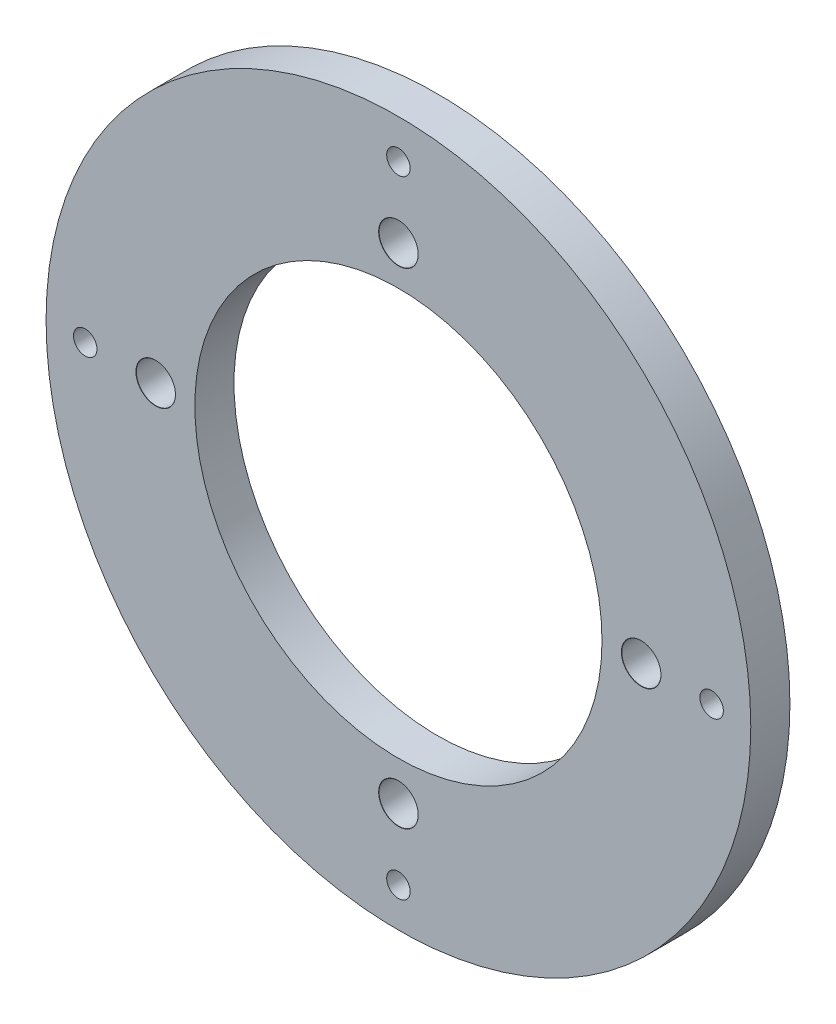
ISO-10303-21;
HEADER;
FILE_DESCRIPTION(('STEP AP214'),'2;1');
FILE_NAME('part.step','',(''),(''),'','','');
FILE_SCHEMA(('AUTOMOTIVE_DESIGN { 1 0 10303 214 1 1 1 1 }'));
ENDSEC;
DATA;
#1=APPLICATION_CONTEXT('core data for automotive mechanical design processes');
#2=APPLICATION_PROTOCOL_DEFINITION('international standard','automotive_design',2000,#1);
#3=PRODUCT_CONTEXT('',#1,'mechanical');
#4=PRODUCT('Part','Part','',(#3));
#5=PRODUCT_RELATED_PRODUCT_CATEGORY('part','',(#4));
#6=PRODUCT_DEFINITION_FORMATION('','',#4);
#7=PRODUCT_DEFINITION_CONTEXT('part definition',#1,'design');
#8=PRODUCT_DEFINITION('design','',#6,#7);
#9=PRODUCT_DEFINITION_SHAPE('','',#8);
#10=(LENGTH_UNIT() NAMED_UNIT(*) SI_UNIT(.MILLI.,.METRE.));
#11=(NAMED_UNIT(*) PLANE_ANGLE_UNIT() SI_UNIT($,.RADIAN.));
#12=(NAMED_UNIT(*) SI_UNIT($,.STERADIAN.) SOLID_ANGLE_UNIT());
#13=UNCERTAINTY_MEASURE_WITH_UNIT(LENGTH_MEASURE(1.E-05),#10,'distance_accuracy_value','');
#14=(GEOMETRIC_REPRESENTATION_CONTEXT(3) GLOBAL_UNCERTAINTY_ASSIGNED_CONTEXT((#13)) GLOBAL_UNIT_ASSIGNED_CONTEXT((#10,
#11,#12)) REPRESENTATION_CONTEXT('',''));
#15=CARTESIAN_POINT('',(0.,0.,0.));
#16=DIRECTION('',(0.,0.,1.));
#17=DIRECTION('',(1.,0.,0.));
#18=AXIS2_PLACEMENT_3D('',#15,#16,#17);
#19=CARTESIAN_POINT('',(0.,0.,5.));
#20=DIRECTION('',(0.,0.,1.));
#21=DIRECTION('',(1.,0.,0.));
#22=AXIS2_PLACEMENT_3D('',#19,#20,#21);
#23=PLANE('',#22);
#24=CARTESIAN_POINT('',(0.,40.,5.));
#25=DIRECTION('',(0.,0.,-1.));
#26=DIRECTION('',(-1.,0.,0.));
#27=AXIS2_PLACEMENT_3D('',#24,#25,#26);
#28=CIRCLE('',#27,1.49999999999999);
#29=CARTESIAN_POINT('',(-1.49999999999999,40.,5.));
#30=VERTEX_POINT('',#29);
#31=EDGE_CURVE('E143',#30,#30,#28,.T.);
#32=ORIENTED_EDGE('',*,*,#31,.T.);
#33=EDGE_LOOP('',(#32));
#34=FACE_BOUND('',#33,.T.);
#35=CARTESIAN_POINT('',(-40.,0.,5.));
#36=DIRECTION('',(0.,0.,-1.));
#37=DIRECTION('',(-1.,0.,0.));
#38=AXIS2_PLACEMENT_3D('',#35,#36,#37);
#39=CIRCLE('',#38,1.49999999999999);
#40=CARTESIAN_POINT('',(-41.5,0.,5.));
#41=VERTEX_POINT('',#40);
#42=EDGE_CURVE('E131',#41,#41,#39,.T.);
#43=ORIENTED_EDGE('',*,*,#42,.T.);
#44=EDGE_LOOP('',(#43));
#45=FACE_BOUND('',#44,.T.);
#46=CARTESIAN_POINT('',(0.,-40.,5.));
#47=DIRECTION('',(0.,0.,-1.));
#48=DIRECTION('',(-1.,0.,0.));
#49=AXIS2_PLACEMENT_3D('',#46,#47,#48);
#50=CIRCLE('',#49,1.49999999999999);
#51=CARTESIAN_POINT('',(-1.49999999999999,-40.,5.));
#52=VERTEX_POINT('',#51);
#53=EDGE_CURVE('E119',#52,#52,#50,.T.);
#54=ORIENTED_EDGE('',*,*,#53,.T.);
#55=EDGE_LOOP('',(#54));
#56=FACE_BOUND('',#55,.T.);
#57=CARTESIAN_POINT('',(40.,0.,5.));
#58=DIRECTION('',(0.,0.,-1.));
#59=DIRECTION('',(-1.,0.,0.));
#60=AXIS2_PLACEMENT_3D('',#57,#58,#59);
#61=CIRCLE('',#60,1.49999999999999);
#62=CARTESIAN_POINT('',(38.5,0.,5.));
#63=VERTEX_POINT('',#62);
#64=EDGE_CURVE('E107',#63,#63,#61,.T.);
#65=ORIENTED_EDGE('',*,*,#64,.T.);
#66=EDGE_LOOP('',(#65));
#67=FACE_BOUND('',#66,.T.);
#68=CARTESIAN_POINT('',(0.,31.,5.));
#69=DIRECTION('',(0.,0.,1.));
#70=DIRECTION('',(1.,0.,0.));
#71=AXIS2_PLACEMENT_3D('',#68,#69,#70);
#72=CIRCLE('',#71,2.525);
#73=CARTESIAN_POINT('',(2.525,31.,5.));
#74=VERTEX_POINT('',#73);
#75=EDGE_CURVE('E103',#74,#74,#72,.T.);
#76=ORIENTED_EDGE('',*,*,#75,.F.);
#77=EDGE_LOOP('',(#76));
#78=FACE_BOUND('',#77,.T.);
#79=CARTESIAN_POINT('',(-31.,0.,5.));
#80=DIRECTION('',(0.,0.,1.));
#81=DIRECTION('',(1.,0.,0.));
#82=AXIS2_PLACEMENT_3D('',#79,#80,#81);
#83=CIRCLE('',#82,2.525);
#84=CARTESIAN_POINT('',(-28.475,0.,5.));
#85=VERTEX_POINT('',#84);
#86=EDGE_CURVE('E91',#85,#85,#83,.T.);
#87=ORIENTED_EDGE('',*,*,#86,.F.);
#88=EDGE_LOOP('',(#87));
#89=FACE_BOUND('',#88,.T.);
#90=CARTESIAN_POINT('',(0.,-31.,5.));
#91=DIRECTION('',(0.,0.,1.));
#92=DIRECTION('',(1.,0.,0.));
#93=AXIS2_PLACEMENT_3D('',#90,#91,#92);
#94=CIRCLE('',#93,2.525);
#95=CARTESIAN_POINT('',(2.525,-31.,5.));
#96=VERTEX_POINT('',#95);
#97=EDGE_CURVE('E79',#96,#96,#94,.T.);
#98=ORIENTED_EDGE('',*,*,#97,.F.);
#99=EDGE_LOOP('',(#98));
#100=FACE_BOUND('',#99,.T.);
#101=CARTESIAN_POINT('',(31.,0.,5.));
#102=DIRECTION('',(0.,0.,1.));
#103=DIRECTION('',(1.,0.,0.));
#104=AXIS2_PLACEMENT_3D('',#101,#102,#103);
#105=CIRCLE('',#104,2.525);
#106=CARTESIAN_POINT('',(33.525,0.,5.));
#107=VERTEX_POINT('',#106);
#108=EDGE_CURVE('E67',#107,#107,#105,.T.);
#109=ORIENTED_EDGE('',*,*,#108,.F.);
#110=EDGE_LOOP('',(#109));
#111=FACE_BOUND('',#110,.T.);
#112=CARTESIAN_POINT('',(0.,0.,5.));
#113=DIRECTION('',(0.,0.,1.));
#114=DIRECTION('',(1.,0.,0.));
#115=AXIS2_PLACEMENT_3D('',#112,#113,#114);
#116=CIRCLE('',#115,45.);
#117=CARTESIAN_POINT('',(45.,0.,5.));
#118=VERTEX_POINT('',#117);
#119=EDGE_CURVE('E10',#118,#118,#116,.T.);
#120=ORIENTED_EDGE('',*,*,#119,.T.);
#121=EDGE_LOOP('',(#120));
#122=FACE_BOUND('',#121,.T.);
#123=CARTESIAN_POINT('',(0.,0.,5.));
#124=DIRECTION('',(0.,0.,1.));
#125=DIRECTION('',(1.,0.,0.));
#126=AXIS2_PLACEMENT_3D('',#123,#124,#125);
#127=CIRCLE('',#126,26.);
#128=CARTESIAN_POINT('',(26.,0.,5.));
#129=VERTEX_POINT('',#128);
#130=EDGE_CURVE('E50',#129,#129,#127,.T.);
#131=ORIENTED_EDGE('',*,*,#130,.F.);
#132=EDGE_LOOP('',(#131));
#133=FACE_BOUND('',#132,.T.);
#134=ADVANCED_FACE('F37',(#34,#45,#56,#67,#78,#89,#100,#111,#122,#133),#23,.T.);
#135=CARTESIAN_POINT('',(0.,0.,0.));
#136=DIRECTION('',(0.,0.,1.));
#137=DIRECTION('',(1.,0.,0.));
#138=AXIS2_PLACEMENT_3D('',#135,#136,#137);
#139=PLANE('',#138);
#140=CARTESIAN_POINT('',(0.,40.,0.));
#141=DIRECTION('',(0.,0.,-1.));
#142=DIRECTION('',(-1.,0.,0.));
#143=AXIS2_PLACEMENT_3D('',#140,#141,#142);
#144=CIRCLE('',#143,1.525);
#145=CARTESIAN_POINT('',(-1.525,40.,0.));
#146=VERTEX_POINT('',#145);
#147=EDGE_CURVE('E151',#146,#146,#144,.T.);
#148=ORIENTED_EDGE('',*,*,#147,.F.);
#149=EDGE_LOOP('',(#148));
#150=FACE_BOUND('',#149,.T.);
#151=CARTESIAN_POINT('',(-40.,0.,0.));
#152=DIRECTION('',(0.,0.,-1.));
#153=DIRECTION('',(-1.,0.,0.));
#154=AXIS2_PLACEMENT_3D('',#151,#152,#153);
#155=CIRCLE('',#154,1.525);
#156=CARTESIAN_POINT('',(-41.525,0.,0.));
#157=VERTEX_POINT('',#156);
#158=EDGE_CURVE('E139',#157,#157,#155,.T.);
#159=ORIENTED_EDGE('',*,*,#158,.F.);
#160=EDGE_LOOP('',(#159));
#161=FACE_BOUND('',#160,.T.);
#162=CARTESIAN_POINT('',(0.,-40.,0.));
#163=DIRECTION('',(0.,0.,-1.));
#164=DIRECTION('',(-1.,0.,0.));
#165=AXIS2_PLACEMENT_3D('',#162,#163,#164);
#166=CIRCLE('',#165,1.525);
#167=CARTESIAN_POINT('',(-1.525,-40.,0.));
#168=VERTEX_POINT('',#167);
#169=EDGE_CURVE('E127',#168,#168,#166,.T.);
#170=ORIENTED_EDGE('',*,*,#169,.F.);
#171=EDGE_LOOP('',(#170));
#172=FACE_BOUND('',#171,.T.);
#173=CARTESIAN_POINT('',(40.,0.,0.));
#174=DIRECTION('',(0.,0.,-1.));
#175=DIRECTION('',(-1.,0.,0.));
#176=AXIS2_PLACEMENT_3D('',#173,#174,#175);
#177=CIRCLE('',#176,1.525);
#178=CARTESIAN_POINT('',(38.475,0.,0.));
#179=VERTEX_POINT('',#178);
#180=EDGE_CURVE('E115',#179,#179,#177,.T.);
#181=ORIENTED_EDGE('',*,*,#180,.F.);
#182=EDGE_LOOP('',(#181));
#183=FACE_BOUND('',#182,.T.);
#184=CARTESIAN_POINT('',(0.,31.,0.));
#185=DIRECTION('',(0.,0.,1.));
#186=DIRECTION('',(1.,0.,0.));
#187=AXIS2_PLACEMENT_3D('',#184,#185,#186);
#188=CIRCLE('',#187,2.5);
#189=CARTESIAN_POINT('',(2.5,31.,0.));
#190=VERTEX_POINT('',#189);
#191=EDGE_CURVE('E95',#190,#190,#188,.T.);
#192=ORIENTED_EDGE('',*,*,#191,.T.);
#193=EDGE_LOOP('',(#192));
#194=FACE_BOUND('',#193,.T.);
#195=CARTESIAN_POINT('',(-31.,0.,0.));
#196=DIRECTION('',(0.,0.,1.));
#197=DIRECTION('',(1.,0.,0.));
#198=AXIS2_PLACEMENT_3D('',#195,#196,#197);
#199=CIRCLE('',#198,2.5);
#200=CARTESIAN_POINT('',(-28.5,0.,0.));
#201=VERTEX_POINT('',#200);
#202=EDGE_CURVE('E83',#201,#201,#199,.T.);
#203=ORIENTED_EDGE('',*,*,#202,.T.);
#204=EDGE_LOOP('',(#203));
#205=FACE_BOUND('',#204,.T.);
#206=CARTESIAN_POINT('',(0.,-31.,0.));
#207=DIRECTION('',(0.,0.,1.));
#208=DIRECTION('',(1.,0.,0.));
#209=AXIS2_PLACEMENT_3D('',#206,#207,#208);
#210=CIRCLE('',#209,2.5);
#211=CARTESIAN_POINT('',(2.5,-31.,0.));
#212=VERTEX_POINT('',#211);
#213=EDGE_CURVE('E71',#212,#212,#210,.T.);
#214=ORIENTED_EDGE('',*,*,#213,.T.);
#215=EDGE_LOOP('',(#214));
#216=FACE_BOUND('',#215,.T.);
#217=CARTESIAN_POINT('',(31.,0.,0.));
#218=DIRECTION('',(0.,0.,1.));
#219=DIRECTION('',(1.,0.,0.));
#220=AXIS2_PLACEMENT_3D('',#217,#218,#219);
#221=CIRCLE('',#220,2.5);
#222=CARTESIAN_POINT('',(33.5,0.,0.));
#223=VERTEX_POINT('',#222);
#224=EDGE_CURVE('E56',#223,#223,#221,.T.);
#225=ORIENTED_EDGE('',*,*,#224,.T.);
#226=EDGE_LOOP('',(#225));
#227=FACE_BOUND('',#226,.T.);
#228=CARTESIAN_POINT('',(0.,0.,0.));
#229=DIRECTION('',(0.,0.,1.));
#230=DIRECTION('',(1.,0.,0.));
#231=AXIS2_PLACEMENT_3D('',#228,#229,#230);
#232=CIRCLE('',#231,45.);
#233=CARTESIAN_POINT('',(45.,0.,0.));
#234=VERTEX_POINT('',#233);
#235=EDGE_CURVE('E41',#234,#234,#232,.T.);
#236=ORIENTED_EDGE('',*,*,#235,.F.);
#237=EDGE_LOOP('',(#236));
#238=FACE_BOUND('',#237,.T.);
#239=CARTESIAN_POINT('',(0.,0.,0.));
#240=DIRECTION('',(0.,0.,1.));
#241=DIRECTION('',(1.,0.,0.));
#242=AXIS2_PLACEMENT_3D('',#239,#240,#241);
#243=CIRCLE('',#242,26.);
#244=CARTESIAN_POINT('',(26.,0.,0.));
#245=VERTEX_POINT('',#244);
#246=EDGE_CURVE('E52',#245,#245,#243,.T.);
#247=ORIENTED_EDGE('',*,*,#246,.T.);
#248=EDGE_LOOP('',(#247));
#249=FACE_BOUND('',#248,.T.);
#250=ADVANCED_FACE('F158',(#150,#161,#172,#183,#194,#205,#216,#227,#238,#249),#139,.F.);
#251=CARTESIAN_POINT('',(0.,0.,5.));
#252=DIRECTION('',(0.,0.,-1.));
#253=DIRECTION('',(-1.,0.,0.));
#254=AXIS2_PLACEMENT_3D('',#251,#252,#253);
#255=CYLINDRICAL_SURFACE('',#254,45.);
#256=ORIENTED_EDGE('',*,*,#119,.F.);
#257=EDGE_LOOP('',(#256));
#258=FACE_BOUND('',#257,.T.);
#259=ORIENTED_EDGE('',*,*,#235,.T.);
#260=EDGE_LOOP('',(#259));
#261=FACE_BOUND('',#260,.T.);
#262=ADVANCED_FACE('F39',(#258,#261),#255,.T.);
#263=CARTESIAN_POINT('',(0.,0.,5.));
#264=DIRECTION('',(0.,0.,-1.));
#265=DIRECTION('',(-1.,0.,0.));
#266=AXIS2_PLACEMENT_3D('',#263,#264,#265);
#267=CYLINDRICAL_SURFACE('',#266,26.);
#268=ORIENTED_EDGE('',*,*,#130,.T.);
#269=EDGE_LOOP('',(#268));
#270=FACE_BOUND('',#269,.T.);
#271=ORIENTED_EDGE('',*,*,#246,.F.);
#272=EDGE_LOOP('',(#271));
#273=FACE_BOUND('',#272,.T.);
#274=ADVANCED_FACE('F179',(#270,#273),#267,.F.);
#275=CARTESIAN_POINT('',(31.,0.,5.));
#276=DIRECTION('',(0.,0.,1.));
#277=DIRECTION('',(1.,0.,0.));
#278=AXIS2_PLACEMENT_3D('',#275,#276,#277);
#279=CYLINDRICAL_SURFACE('',#278,2.5);
#280=ORIENTED_EDGE('',*,*,#224,.F.);
#281=EDGE_LOOP('',(#280));
#282=FACE_BOUND('',#281,.T.);
#283=CARTESIAN_POINT('',(31.,0.,4.975));
#284=DIRECTION('',(0.,0.,1.));
#285=DIRECTION('',(1.,0.,0.));
#286=AXIS2_PLACEMENT_3D('',#283,#284,#285);
#287=CIRCLE('',#286,2.5);
#288=CARTESIAN_POINT('',(33.5,0.,4.975));
#289=VERTEX_POINT('',#288);
#290=EDGE_CURVE('E63',#289,#289,#287,.T.);
#291=ORIENTED_EDGE('',*,*,#290,.T.);
#292=EDGE_LOOP('',(#291));
#293=FACE_BOUND('',#292,.T.);
#294=ADVANCED_FACE('F181',(#282,#293),#279,.F.);
#295=CARTESIAN_POINT('',(31.,0.,5.));
#296=DIRECTION('',(0.,0.,1.));
#297=DIRECTION('',(1.,0.,0.));
#298=AXIS2_PLACEMENT_3D('',#295,#296,#297);
#299=CONICAL_SURFACE('',#298,2.525,0.785398163397344);
#300=ORIENTED_EDGE('',*,*,#290,.F.);
#301=EDGE_LOOP('',(#300));
#302=FACE_BOUND('',#301,.T.);
#303=ORIENTED_EDGE('',*,*,#108,.T.);
#304=EDGE_LOOP('',(#303));
#305=FACE_BOUND('',#304,.T.);
#306=ADVANCED_FACE('F188',(#302,#305),#299,.F.);
#307=CARTESIAN_POINT('',(0.,-31.,5.));
#308=DIRECTION('',(0.,0.,1.));
#309=DIRECTION('',(1.,0.,0.));
#310=AXIS2_PLACEMENT_3D('',#307,#308,#309);
#311=CYLINDRICAL_SURFACE('',#310,2.5);
#312=ORIENTED_EDGE('',*,*,#213,.F.);
#313=EDGE_LOOP('',(#312));
#314=FACE_BOUND('',#313,.T.);
#315=CARTESIAN_POINT('',(0.,-31.,4.975));
#316=DIRECTION('',(0.,0.,1.));
#317=DIRECTION('',(1.,0.,0.));
#318=AXIS2_PLACEMENT_3D('',#315,#316,#317);
#319=CIRCLE('',#318,2.5);
#320=CARTESIAN_POINT('',(2.5,-31.,4.975));
#321=VERTEX_POINT('',#320);
#322=EDGE_CURVE('E75',#321,#321,#319,.T.);
#323=ORIENTED_EDGE('',*,*,#322,.T.);
#324=EDGE_LOOP('',(#323));
#325=FACE_BOUND('',#324,.T.);
#326=ADVANCED_FACE('F216',(#314,#325),#311,.F.);
#327=CARTESIAN_POINT('',(0.,-31.,5.));
#328=DIRECTION('',(0.,0.,1.));
#329=DIRECTION('',(1.,0.,0.));
#330=AXIS2_PLACEMENT_3D('',#327,#328,#329);
#331=CONICAL_SURFACE('',#330,2.525,0.785398163397405);
#332=ORIENTED_EDGE('',*,*,#322,.F.);
#333=EDGE_LOOP('',(#332));
#334=FACE_BOUND('',#333,.T.);
#335=ORIENTED_EDGE('',*,*,#97,.T.);
#336=EDGE_LOOP('',(#335));
#337=FACE_BOUND('',#336,.T.);
#338=ADVANCED_FACE('F222',(#334,#337),#331,.F.);
#339=CARTESIAN_POINT('',(-31.,0.,5.));
#340=DIRECTION('',(0.,0.,1.));
#341=DIRECTION('',(1.,0.,0.));
#342=AXIS2_PLACEMENT_3D('',#339,#340,#341);
#343=CYLINDRICAL_SURFACE('',#342,2.5);
#344=ORIENTED_EDGE('',*,*,#202,.F.);
#345=EDGE_LOOP('',(#344));
#346=FACE_BOUND('',#345,.T.);
#347=CARTESIAN_POINT('',(-31.,0.,4.975));
#348=DIRECTION('',(0.,0.,1.));
#349=DIRECTION('',(1.,0.,0.));
#350=AXIS2_PLACEMENT_3D('',#347,#348,#349);
#351=CIRCLE('',#350,2.5);
#352=CARTESIAN_POINT('',(-28.5,0.,4.975));
#353=VERTEX_POINT('',#352);
#354=EDGE_CURVE('E87',#353,#353,#351,.T.);
#355=ORIENTED_EDGE('',*,*,#354,.T.);
#356=EDGE_LOOP('',(#355));
#357=FACE_BOUND('',#356,.T.);
#358=ADVANCED_FACE('F229',(#346,#357),#343,.F.);
#359=CARTESIAN_POINT('',(-31.,0.,5.));
#360=DIRECTION('',(0.,0.,1.));
#361=DIRECTION('',(1.,0.,0.));
#362=AXIS2_PLACEMENT_3D('',#359,#360,#361);
#363=CONICAL_SURFACE('',#362,2.525,0.785398163397414);
#364=ORIENTED_EDGE('',*,*,#354,.F.);
#365=EDGE_LOOP('',(#364));
#366=FACE_BOUND('',#365,.T.);
#367=ORIENTED_EDGE('',*,*,#86,.T.);
#368=EDGE_LOOP('',(#367));
#369=FACE_BOUND('',#368,.T.);
#370=ADVANCED_FACE('F233',(#366,#369),#363,.F.);
#371=CARTESIAN_POINT('',(0.,31.,5.));
#372=DIRECTION('',(0.,0.,1.));
#373=DIRECTION('',(1.,0.,0.));
#374=AXIS2_PLACEMENT_3D('',#371,#372,#373);
#375=CYLINDRICAL_SURFACE('',#374,2.5);
#376=ORIENTED_EDGE('',*,*,#191,.F.);
#377=EDGE_LOOP('',(#376));
#378=FACE_BOUND('',#377,.T.);
#379=CARTESIAN_POINT('',(0.,31.,4.975));
#380=DIRECTION('',(0.,0.,1.));
#381=DIRECTION('',(1.,0.,0.));
#382=AXIS2_PLACEMENT_3D('',#379,#380,#381);
#383=CIRCLE('',#382,2.5);
#384=CARTESIAN_POINT('',(2.5,31.,4.975));
#385=VERTEX_POINT('',#384);
#386=EDGE_CURVE('E99',#385,#385,#383,.T.);
#387=ORIENTED_EDGE('',*,*,#386,.T.);
#388=EDGE_LOOP('',(#387));
#389=FACE_BOUND('',#388,.T.);
#390=ADVANCED_FACE('F237',(#378,#389),#375,.F.);
#391=CARTESIAN_POINT('',(0.,31.,5.));
#392=DIRECTION('',(0.,0.,1.));
#393=DIRECTION('',(1.,0.,0.));
#394=AXIS2_PLACEMENT_3D('',#391,#392,#393);
#395=CONICAL_SURFACE('',#394,2.525,0.785398163397405);
#396=ORIENTED_EDGE('',*,*,#386,.F.);
#397=EDGE_LOOP('',(#396));
#398=FACE_BOUND('',#397,.T.);
#399=ORIENTED_EDGE('',*,*,#75,.T.);
#400=EDGE_LOOP('',(#399));
#401=FACE_BOUND('',#400,.T.);
#402=ADVANCED_FACE('F241',(#398,#401),#395,.F.);
#403=CARTESIAN_POINT('',(40.,0.,0.));
#404=DIRECTION('',(0.,0.,-1.));
#405=DIRECTION('',(-1.,0.,0.));
#406=AXIS2_PLACEMENT_3D('',#403,#404,#405);
#407=CYLINDRICAL_SURFACE('',#406,1.49999999999999);
#408=ORIENTED_EDGE('',*,*,#64,.F.);
#409=EDGE_LOOP('',(#408));
#410=FACE_BOUND('',#409,.T.);
#411=CARTESIAN_POINT('',(40.,0.,0.0249999999999972));
#412=DIRECTION('',(0.,0.,-1.));
#413=DIRECTION('',(-1.,0.,0.));
#414=AXIS2_PLACEMENT_3D('',#411,#412,#413);
#415=CIRCLE('',#414,1.49999999999999);
#416=CARTESIAN_POINT('',(38.5,0.,0.0249999999999972));
#417=VERTEX_POINT('',#416);
#418=EDGE_CURVE('E111',#417,#417,#415,.T.);
#419=ORIENTED_EDGE('',*,*,#418,.T.);
#420=EDGE_LOOP('',(#419));
#421=FACE_BOUND('',#420,.T.);
#422=ADVANCED_FACE('F245',(#410,#421),#407,.F.);
#423=CARTESIAN_POINT('',(40.,0.,0.));
#424=DIRECTION('',(0.,0.,-1.));
#425=DIRECTION('',(-1.,0.,0.));
#426=AXIS2_PLACEMENT_3D('',#423,#424,#425);
#427=CONICAL_SURFACE('',#426,1.525,0.785398163397691);
#428=ORIENTED_EDGE('',*,*,#418,.F.);
#429=EDGE_LOOP('',(#428));
#430=FACE_BOUND('',#429,.T.);
#431=ORIENTED_EDGE('',*,*,#180,.T.);
#432=EDGE_LOOP('',(#431));
#433=FACE_BOUND('',#432,.T.);
#434=ADVANCED_FACE('F249',(#430,#433),#427,.F.);
#435=CARTESIAN_POINT('',(0.,-40.,0.));
#436=DIRECTION('',(0.,0.,-1.));
#437=DIRECTION('',(-1.,0.,0.));
#438=AXIS2_PLACEMENT_3D('',#435,#436,#437);
#439=CYLINDRICAL_SURFACE('',#438,1.49999999999999);
#440=ORIENTED_EDGE('',*,*,#53,.F.);
#441=EDGE_LOOP('',(#440));
#442=FACE_BOUND('',#441,.T.);
#443=CARTESIAN_POINT('',(0.,-40.,0.0249999999999972));
#444=DIRECTION('',(0.,0.,-1.));
#445=DIRECTION('',(-1.,0.,0.));
#446=AXIS2_PLACEMENT_3D('',#443,#444,#445);
#447=CIRCLE('',#446,1.49999999999999);
#448=CARTESIAN_POINT('',(-1.49999999999999,-40.,0.0249999999999972));
#449=VERTEX_POINT('',#448);
#450=EDGE_CURVE('E123',#449,#449,#447,.T.);
#451=ORIENTED_EDGE('',*,*,#450,.T.);
#452=EDGE_LOOP('',(#451));
#453=FACE_BOUND('',#452,.T.);
#454=ADVANCED_FACE('F253',(#442,#453),#439,.F.);
#455=CARTESIAN_POINT('',(0.,-40.,0.));
#456=DIRECTION('',(0.,0.,-1.));
#457=DIRECTION('',(-1.,0.,0.));
#458=AXIS2_PLACEMENT_3D('',#455,#456,#457);
#459=CONICAL_SURFACE('',#458,1.525,0.785398163397726);
#460=ORIENTED_EDGE('',*,*,#450,.F.);
#461=EDGE_LOOP('',(#460));
#462=FACE_BOUND('',#461,.T.);
#463=ORIENTED_EDGE('',*,*,#169,.T.);
#464=EDGE_LOOP('',(#463));
#465=FACE_BOUND('',#464,.T.);
#466=ADVANCED_FACE('F257',(#462,#465),#459,.F.);
#467=CARTESIAN_POINT('',(-40.,0.,0.));
#468=DIRECTION('',(0.,0.,-1.));
#469=DIRECTION('',(-1.,0.,0.));
#470=AXIS2_PLACEMENT_3D('',#467,#468,#469);
#471=CYLINDRICAL_SURFACE('',#470,1.49999999999999);
#472=ORIENTED_EDGE('',*,*,#42,.F.);
#473=EDGE_LOOP('',(#472));
#474=FACE_BOUND('',#473,.T.);
#475=CARTESIAN_POINT('',(-40.,0.,0.0249999999999972));
#476=DIRECTION('',(0.,0.,-1.));
#477=DIRECTION('',(-1.,0.,0.));
#478=AXIS2_PLACEMENT_3D('',#475,#476,#477);
#479=CIRCLE('',#478,1.49999999999999);
#480=CARTESIAN_POINT('',(-41.5,0.,0.0249999999999972));
#481=VERTEX_POINT('',#480);
#482=EDGE_CURVE('E135',#481,#481,#479,.T.);
#483=ORIENTED_EDGE('',*,*,#482,.T.);
#484=EDGE_LOOP('',(#483));
#485=FACE_BOUND('',#484,.T.);
#486=ADVANCED_FACE('F261',(#474,#485),#471,.F.);
#487=CARTESIAN_POINT('',(-40.,0.,0.));
#488=DIRECTION('',(0.,0.,-1.));
#489=DIRECTION('',(-1.,0.,0.));
#490=AXIS2_PLACEMENT_3D('',#487,#488,#489);
#491=CONICAL_SURFACE('',#490,1.525,0.785398163397691);
#492=ORIENTED_EDGE('',*,*,#482,.F.);
#493=EDGE_LOOP('',(#492));
#494=FACE_BOUND('',#493,.T.);
#495=ORIENTED_EDGE('',*,*,#158,.T.);
#496=EDGE_LOOP('',(#495));
#497=FACE_BOUND('',#496,.T.);
#498=ADVANCED_FACE('F265',(#494,#497),#491,.F.);
#499=CARTESIAN_POINT('',(0.,40.,0.));
#500=DIRECTION('',(0.,0.,-1.));
#501=DIRECTION('',(-1.,0.,0.));
#502=AXIS2_PLACEMENT_3D('',#499,#500,#501);
#503=CYLINDRICAL_SURFACE('',#502,1.49999999999999);
#504=ORIENTED_EDGE('',*,*,#31,.F.);
#505=EDGE_LOOP('',(#504));
#506=FACE_BOUND('',#505,.T.);
#507=CARTESIAN_POINT('',(0.,40.,0.0249999999999972));
#508=DIRECTION('',(0.,0.,-1.));
#509=DIRECTION('',(-1.,0.,0.));
#510=AXIS2_PLACEMENT_3D('',#507,#508,#509);
#511=CIRCLE('',#510,1.49999999999999);
#512=CARTESIAN_POINT('',(-1.49999999999999,40.,0.0249999999999972));
#513=VERTEX_POINT('',#512);
#514=EDGE_CURVE('E147',#513,#513,#511,.T.);
#515=ORIENTED_EDGE('',*,*,#514,.T.);
#516=EDGE_LOOP('',(#515));
#517=FACE_BOUND('',#516,.T.);
#518=ADVANCED_FACE('F269',(#506,#517),#503,.F.);
#519=CARTESIAN_POINT('',(0.,40.,0.));
#520=DIRECTION('',(0.,0.,-1.));
#521=DIRECTION('',(-1.,0.,0.));
#522=AXIS2_PLACEMENT_3D('',#519,#520,#521);
#523=CONICAL_SURFACE('',#522,1.525,0.785398163397726);
#524=ORIENTED_EDGE('',*,*,#514,.F.);
#525=EDGE_LOOP('',(#524));
#526=FACE_BOUND('',#525,.T.);
#527=ORIENTED_EDGE('',*,*,#147,.T.);
#528=EDGE_LOOP('',(#527));
#529=FACE_BOUND('',#528,.T.);
#530=ADVANCED_FACE('F156',(#526,#529),#523,.F.);
#531=CLOSED_SHELL('',(#134,#250,#262,#274,#294,#306,#326,#338,#358,#370,#390,#402,#422,#434,
#454,#466,#486,#498,#518,#530));
#532=MANIFOLD_SOLID_BREP('B2',#531);
#533=ADVANCED_BREP_SHAPE_REPRESENTATION('',(#18,#532),#14);
#534=SHAPE_DEFINITION_REPRESENTATION(#9,#533);
ENDSEC;
END-ISO-10303-21;
